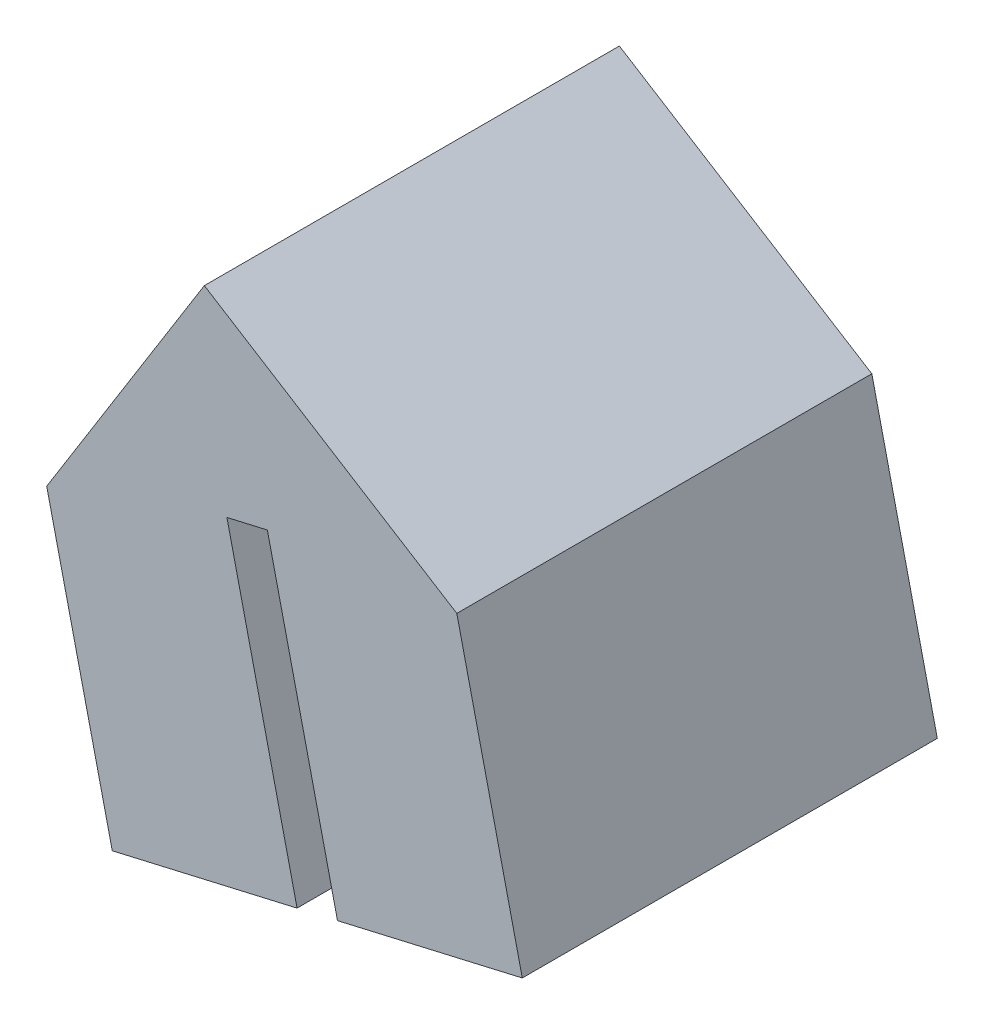
ISO-10303-21;
HEADER;
FILE_DESCRIPTION(('STEP AP214'),'2;1');
FILE_NAME('part.step','',(''),(''),'','','');
FILE_SCHEMA(('AUTOMOTIVE_DESIGN { 1 0 10303 214 1 1 1 1 }'));
ENDSEC;
DATA;
#1=APPLICATION_CONTEXT('core data for automotive mechanical design processes');
#2=APPLICATION_PROTOCOL_DEFINITION('international standard','automotive_design',2000,#1);
#3=PRODUCT_CONTEXT('',#1,'mechanical');
#4=PRODUCT('Part','Part','',(#3));
#5=PRODUCT_RELATED_PRODUCT_CATEGORY('part','',(#4));
#6=PRODUCT_DEFINITION_FORMATION('','',#4);
#7=PRODUCT_DEFINITION_CONTEXT('part definition',#1,'design');
#8=PRODUCT_DEFINITION('design','',#6,#7);
#9=PRODUCT_DEFINITION_SHAPE('','',#8);
#10=(LENGTH_UNIT() NAMED_UNIT(*) SI_UNIT(.MILLI.,.METRE.));
#11=(NAMED_UNIT(*) PLANE_ANGLE_UNIT() SI_UNIT($,.RADIAN.));
#12=(NAMED_UNIT(*) SI_UNIT($,.STERADIAN.) SOLID_ANGLE_UNIT());
#13=UNCERTAINTY_MEASURE_WITH_UNIT(LENGTH_MEASURE(1.E-05),#10,'distance_accuracy_value','');
#14=(GEOMETRIC_REPRESENTATION_CONTEXT(3) GLOBAL_UNCERTAINTY_ASSIGNED_CONTEXT((#13)) GLOBAL_UNIT_ASSIGNED_CONTEXT((#10,
#11,#12)) REPRESENTATION_CONTEXT('',''));
#15=CARTESIAN_POINT('',(0.,0.,0.));
#16=DIRECTION('',(0.,0.,1.));
#17=DIRECTION('',(1.,0.,0.));
#18=AXIS2_PLACEMENT_3D('',#15,#16,#17);
#19=CARTESIAN_POINT('',(2.25778080371376,-9.74178761020695,20.));
#20=DIRECTION('',(-0.225361932494891,0.974275114832648,0.));
#21=DIRECTION('',(-0.974275114832648,-0.225361932494891,0.));
#22=AXIS2_PLACEMENT_3D('',#19,#20,#21);
#23=PLANE('',#22);
#24=DIRECTION('',(0.974275114832648,0.225361932494891,0.));
#25=VECTOR('',#24,1.);
#26=CARTESIAN_POINT('',(2.25778080371376,-9.74178761020695,20.));
#27=LINE('',#26,#25);
#28=CARTESIAN_POINT('',(6.15488126752971,-8.84033989961829,20.));
#29=VERTEX_POINT('',#28);
#30=CARTESIAN_POINT('',(15.0597558273492,-6.78053188092321,20.));
#31=VERTEX_POINT('',#30);
#32=EDGE_CURVE('E119',#29,#31,#27,.T.);
#33=ORIENTED_EDGE('',*,*,#32,.F.);
#34=DIRECTION('',(0.,0.,1.));
#35=VECTOR('',#34,1.);
#36=CARTESIAN_POINT('',(6.15488126752971,-8.84033989961829,0.));
#37=LINE('',#36,#35);
#38=CARTESIAN_POINT('',(6.15488126752971,-8.84033989961829,0.));
#39=VERTEX_POINT('',#38);
#40=EDGE_CURVE('E106',#39,#29,#37,.T.);
#41=ORIENTED_EDGE('',*,*,#40,.F.);
#42=DIRECTION('',(0.974275114832648,0.225361932494891,0.));
#43=VECTOR('',#42,1.);
#44=CARTESIAN_POINT('',(2.25778080371376,-9.74178761020695,0.));
#45=LINE('',#44,#43);
#46=CARTESIAN_POINT('',(15.0597558273492,-6.78053188092321,0.));
#47=VERTEX_POINT('',#46);
#48=EDGE_CURVE('E117',#39,#47,#45,.T.);
#49=ORIENTED_EDGE('',*,*,#48,.T.);
#50=DIRECTION('',(0.,0.,1.));
#51=VECTOR('',#50,1.);
#52=CARTESIAN_POINT('',(15.0597558273492,-6.78053188092321,0.));
#53=LINE('',#52,#51);
#54=EDGE_CURVE('E145',#47,#31,#53,.T.);
#55=ORIENTED_EDGE('',*,*,#54,.T.);
#56=EDGE_LOOP('',(#33,#41,#49,#55));
#57=FACE_BOUND('',#56,.T.);
#58=ADVANCED_FACE('F35',(#57),#23,.F.);
#59=CARTESIAN_POINT('',(17.0083060422801,-6.32980795223431,0.));
#60=VERTEX_POINT('',#59);
#61=CARTESIAN_POINT('',(25.9131805918504,-4.26999988923101,0.));
#62=VERTEX_POINT('',#61);
#63=EDGE_CURVE('E127',#60,#62,#45,.T.);
#64=ORIENTED_EDGE('',*,*,#63,.T.);
#65=DIRECTION('',(0.,0.,1.));
#66=VECTOR('',#65,1.);
#67=CARTESIAN_POINT('',(25.9131805918504,-4.26999988923101,0.));
#68=LINE('',#67,#66);
#69=CARTESIAN_POINT('',(25.9131805918504,-4.26999988923101,20.));
#70=VERTEX_POINT('',#69);
#71=EDGE_CURVE('E50',#62,#70,#68,.T.);
#72=ORIENTED_EDGE('',*,*,#71,.T.);
#73=CARTESIAN_POINT('',(17.0083060422801,-6.32980795223431,20.));
#74=VERTEX_POINT('',#73);
#75=EDGE_CURVE('E135',#74,#70,#27,.T.);
#76=ORIENTED_EDGE('',*,*,#75,.F.);
#77=DIRECTION('',(0.,0.,1.));
#78=VECTOR('',#77,1.);
#79=CARTESIAN_POINT('',(17.0083060422801,-6.32980795223431,0.));
#80=LINE('',#79,#78);
#81=EDGE_CURVE('E180',#60,#74,#80,.T.);
#82=ORIENTED_EDGE('',*,*,#81,.F.);
#83=EDGE_LOOP('',(#64,#72,#76,#82));
#84=FACE_BOUND('',#83,.T.);
#85=ADVANCED_FACE('F37',(#84),#23,.F.);
#86=CARTESIAN_POINT('',(10.5912312477967,16.9654301641807,20.));
#87=DIRECTION('',(-0.529561562389836,-0.848271508209038,0.));
#88=DIRECTION('',(0.848271508209038,-0.529561562389836,0.));
#89=AXIS2_PLACEMENT_3D('',#86,#87,#88);
#90=PLANE('',#89);
#91=DIRECTION('',(-0.848271508209038,0.529561562389836,0.));
#92=VECTOR('',#91,1.);
#93=CARTESIAN_POINT('',(10.5912312477967,16.9654301641807,20.));
#94=LINE('',#93,#92);
#95=CARTESIAN_POINT('',(22.7581131260419,9.36985149095679,20.));
#96=VERTEX_POINT('',#95);
#97=CARTESIAN_POINT('',(10.5912312477967,16.9654301641807,20.));
#98=VERTEX_POINT('',#97);
#99=EDGE_CURVE('E143',#96,#98,#94,.T.);
#100=ORIENTED_EDGE('',*,*,#99,.F.);
#101=DIRECTION('',(0.,0.,1.));
#102=VECTOR('',#101,1.);
#103=CARTESIAN_POINT('',(22.7581131260419,9.36985149095679,0.));
#104=LINE('',#103,#102);
#105=CARTESIAN_POINT('',(22.7581131260419,9.36985149095679,0.));
#106=VERTEX_POINT('',#105);
#107=EDGE_CURVE('E162',#106,#96,#104,.T.);
#108=ORIENTED_EDGE('',*,*,#107,.F.);
#109=DIRECTION('',(-0.848271508209038,0.529561562389836,0.));
#110=VECTOR('',#109,1.);
#111=CARTESIAN_POINT('',(10.5912312477967,16.9654301641807,0.));
#112=LINE('',#111,#110);
#113=CARTESIAN_POINT('',(10.5912312477967,16.9654301641807,0.));
#114=VERTEX_POINT('',#113);
#115=EDGE_CURVE('E126',#106,#114,#112,.T.);
#116=ORIENTED_EDGE('',*,*,#115,.T.);
#117=DIRECTION('',(0.,0.,-1.));
#118=VECTOR('',#117,1.);
#119=CARTESIAN_POINT('',(10.5912312477967,16.9654301641807,20.));
#120=LINE('',#119,#118);
#121=EDGE_CURVE('E11',#98,#114,#120,.T.);
#122=ORIENTED_EDGE('',*,*,#121,.F.);
#123=EDGE_LOOP('',(#100,#108,#116,#122));
#124=FACE_BOUND('',#123,.T.);
#125=ADVANCED_FACE('F205',(#124),#90,.F.);
#126=CARTESIAN_POINT('',(0.,0.,20.));
#127=DIRECTION('',(0.848271508209038,-0.529561562389836,0.));
#128=DIRECTION('',(0.529561562389836,0.848271508209038,0.));
#129=AXIS2_PLACEMENT_3D('',#126,#127,#128);
#130=PLANE('',#129);
#131=DIRECTION('',(-0.529561562389836,-0.848271508209038,0.));
#132=VECTOR('',#131,1.);
#133=CARTESIAN_POINT('',(0.,0.,0.));
#134=LINE('',#133,#132);
#135=CARTESIAN_POINT('',(2.99437360334313,4.79649958200584,0.));
#136=VERTEX_POINT('',#135);
#137=EDGE_CURVE('E129',#114,#136,#134,.T.);
#138=ORIENTED_EDGE('',*,*,#137,.T.);
#139=DIRECTION('',(0.,0.,1.));
#140=VECTOR('',#139,1.);
#141=CARTESIAN_POINT('',(2.99437360334313,4.79649958200584,0.));
#142=LINE('',#141,#140);
#143=CARTESIAN_POINT('',(2.99437360334313,4.79649958200584,20.));
#144=VERTEX_POINT('',#143);
#145=EDGE_CURVE('E58',#136,#144,#142,.T.);
#146=ORIENTED_EDGE('',*,*,#145,.T.);
#147=DIRECTION('',(-0.529561562389836,-0.848271508209038,0.));
#148=VECTOR('',#147,1.);
#149=CARTESIAN_POINT('',(0.,0.,20.));
#150=LINE('',#149,#148);
#151=EDGE_CURVE('E43',#98,#144,#150,.T.);
#152=ORIENTED_EDGE('',*,*,#151,.F.);
#153=ORIENTED_EDGE('',*,*,#121,.T.);
#154=EDGE_LOOP('',(#138,#146,#152,#153));
#155=FACE_BOUND('',#154,.T.);
#156=ADVANCED_FACE('F152',(#155),#130,.F.);
#157=CARTESIAN_POINT('',(0.,0.,20.));
#158=DIRECTION('',(0.,0.,1.));
#159=DIRECTION('',(1.,0.,0.));
#160=AXIS2_PLACEMENT_3D('',#157,#158,#159);
#161=PLANE('',#160);
#162=DIRECTION('',(-0.225778080371377,0.974178761020695,0.));
#163=VECTOR('',#162,1.);
#164=CARTESIAN_POINT('',(6.15488126752971,-8.84033989961829,20.));
#165=LINE('',#164,#163);
#166=EDGE_CURVE('E112',#29,#144,#165,.T.);
#167=ORIENTED_EDGE('',*,*,#166,.F.);
#168=ORIENTED_EDGE('',*,*,#32,.T.);
#169=DIRECTION('',(0.225361964344452,-0.974275107465448,0.));
#170=VECTOR('',#169,1.);
#171=CARTESIAN_POINT('',(11.6793263621824,7.8335947310585,20.));
#172=LINE('',#171,#170);
#173=CARTESIAN_POINT('',(11.6793263621824,7.8335947310585,20.));
#174=VERTEX_POINT('',#173);
#175=EDGE_CURVE('E153',#174,#31,#172,.T.);
#176=ORIENTED_EDGE('',*,*,#175,.F.);
#177=DIRECTION('',(-0.974275107465448,-0.225361964344453,0.));
#178=VECTOR('',#177,1.);
#179=CARTESIAN_POINT('',(13.6278765771133,8.28431865974741,20.));
#180=LINE('',#179,#178);
#181=CARTESIAN_POINT('',(13.6278765771133,8.28431865974741,20.));
#182=VERTEX_POINT('',#181);
#183=EDGE_CURVE('E169',#182,#174,#180,.T.);
#184=ORIENTED_EDGE('',*,*,#183,.F.);
#185=DIRECTION('',(-0.225361964344453,0.974275107465448,0.));
#186=VECTOR('',#185,1.);
#187=CARTESIAN_POINT('',(17.0083060422801,-6.32980795223431,20.));
#188=LINE('',#187,#186);
#189=EDGE_CURVE('E156',#74,#182,#188,.T.);
#190=ORIENTED_EDGE('',*,*,#189,.F.);
#191=ORIENTED_EDGE('',*,*,#75,.T.);
#192=DIRECTION('',(0.225361963920355,-0.974275107563547,0.));
#193=VECTOR('',#192,1.);
#194=CARTESIAN_POINT('',(25.9131805918504,-4.26999988923101,20.));
#195=LINE('',#194,#193);
#196=EDGE_CURVE('E163',#96,#70,#195,.T.);
#197=ORIENTED_EDGE('',*,*,#196,.F.);
#198=ORIENTED_EDGE('',*,*,#99,.T.);
#199=ORIENTED_EDGE('',*,*,#151,.T.);
#200=EDGE_LOOP('',(#167,#168,#176,#184,#190,#191,#197,#198,#199));
#201=FACE_BOUND('',#200,.T.);
#202=ADVANCED_FACE('F151',(#201),#161,.T.);
#203=CARTESIAN_POINT('',(0.,0.,0.));
#204=DIRECTION('',(0.,0.,1.));
#205=DIRECTION('',(1.,0.,0.));
#206=AXIS2_PLACEMENT_3D('',#203,#204,#205);
#207=PLANE('',#206);
#208=ORIENTED_EDGE('',*,*,#48,.F.);
#209=DIRECTION('',(-0.225778080371377,0.974178761020695,0.));
#210=VECTOR('',#209,1.);
#211=CARTESIAN_POINT('',(6.15488126752971,-8.84033989961829,0.));
#212=LINE('',#211,#210);
#213=EDGE_CURVE('E103',#39,#136,#212,.T.);
#214=ORIENTED_EDGE('',*,*,#213,.T.);
#215=ORIENTED_EDGE('',*,*,#137,.F.);
#216=ORIENTED_EDGE('',*,*,#115,.F.);
#217=DIRECTION('',(0.225361963920355,-0.974275107563547,0.));
#218=VECTOR('',#217,1.);
#219=CARTESIAN_POINT('',(25.9131805918504,-4.26999988923101,0.));
#220=LINE('',#219,#218);
#221=EDGE_CURVE('E160',#106,#62,#220,.T.);
#222=ORIENTED_EDGE('',*,*,#221,.T.);
#223=ORIENTED_EDGE('',*,*,#63,.F.);
#224=DIRECTION('',(-0.225361964344453,0.974275107465448,0.));
#225=VECTOR('',#224,1.);
#226=CARTESIAN_POINT('',(17.0083060422801,-6.32980795223431,0.));
#227=LINE('',#226,#225);
#228=CARTESIAN_POINT('',(13.6278765771133,8.28431865974741,0.));
#229=VERTEX_POINT('',#228);
#230=EDGE_CURVE('E168',#60,#229,#227,.T.);
#231=ORIENTED_EDGE('',*,*,#230,.T.);
#232=DIRECTION('',(-0.974275107465448,-0.225361964344453,0.));
#233=VECTOR('',#232,1.);
#234=CARTESIAN_POINT('',(13.6278765771133,8.28431865974741,0.));
#235=LINE('',#234,#233);
#236=CARTESIAN_POINT('',(11.6793263621824,7.8335947310585,0.));
#237=VERTEX_POINT('',#236);
#238=EDGE_CURVE('E172',#229,#237,#235,.T.);
#239=ORIENTED_EDGE('',*,*,#238,.T.);
#240=DIRECTION('',(0.225361964344452,-0.974275107465448,0.));
#241=VECTOR('',#240,1.);
#242=CARTESIAN_POINT('',(11.6793263621824,7.8335947310585,0.));
#243=LINE('',#242,#241);
#244=EDGE_CURVE('E125',#237,#47,#243,.T.);
#245=ORIENTED_EDGE('',*,*,#244,.T.);
#246=EDGE_LOOP('',(#208,#214,#215,#216,#222,#223,#231,#239,#245));
#247=FACE_BOUND('',#246,.T.);
#248=ADVANCED_FACE('F122',(#247),#207,.F.);
#249=CARTESIAN_POINT('',(11.6793263621824,7.8335947310585,0.));
#250=DIRECTION('',(-0.974275107465448,-0.225361964344452,0.));
#251=DIRECTION('',(0.225361964344452,-0.974275107465448,0.));
#252=AXIS2_PLACEMENT_3D('',#249,#250,#251);
#253=PLANE('',#252);
#254=ORIENTED_EDGE('',*,*,#175,.T.);
#255=ORIENTED_EDGE('',*,*,#54,.F.);
#256=ORIENTED_EDGE('',*,*,#244,.F.);
#257=DIRECTION('',(0.,0.,1.));
#258=VECTOR('',#257,1.);
#259=CARTESIAN_POINT('',(11.6793263621824,7.8335947310585,0.));
#260=LINE('',#259,#258);
#261=EDGE_CURVE('E132',#237,#174,#260,.T.);
#262=ORIENTED_EDGE('',*,*,#261,.T.);
#263=EDGE_LOOP('',(#254,#255,#256,#262));
#264=FACE_BOUND('',#263,.T.);
#265=ADVANCED_FACE('F184',(#264),#253,.F.);
#266=CARTESIAN_POINT('',(13.6278765771133,8.28431865974741,0.));
#267=DIRECTION('',(-0.225361964344453,0.974275107465448,0.));
#268=DIRECTION('',(-0.974275107465448,-0.225361964344453,0.));
#269=AXIS2_PLACEMENT_3D('',#266,#267,#268);
#270=PLANE('',#269);
#271=ORIENTED_EDGE('',*,*,#183,.T.);
#272=ORIENTED_EDGE('',*,*,#261,.F.);
#273=ORIENTED_EDGE('',*,*,#238,.F.);
#274=DIRECTION('',(0.,0.,1.));
#275=VECTOR('',#274,1.);
#276=CARTESIAN_POINT('',(13.6278765771133,8.28431865974741,0.));
#277=LINE('',#276,#275);
#278=EDGE_CURVE('E179',#229,#182,#277,.T.);
#279=ORIENTED_EDGE('',*,*,#278,.T.);
#280=EDGE_LOOP('',(#271,#272,#273,#279));
#281=FACE_BOUND('',#280,.T.);
#282=ADVANCED_FACE('F188',(#281),#270,.F.);
#283=CARTESIAN_POINT('',(17.0083060422801,-6.32980795223431,0.));
#284=DIRECTION('',(0.974275107465448,0.225361964344453,0.));
#285=DIRECTION('',(-0.225361964344453,0.974275107465448,0.));
#286=AXIS2_PLACEMENT_3D('',#283,#284,#285);
#287=PLANE('',#286);
#288=ORIENTED_EDGE('',*,*,#189,.T.);
#289=ORIENTED_EDGE('',*,*,#278,.F.);
#290=ORIENTED_EDGE('',*,*,#230,.F.);
#291=ORIENTED_EDGE('',*,*,#81,.T.);
#292=EDGE_LOOP('',(#288,#289,#290,#291));
#293=FACE_BOUND('',#292,.T.);
#294=ADVANCED_FACE('F190',(#293),#287,.F.);
#295=CARTESIAN_POINT('',(25.9131805918504,-4.26999988923101,0.));
#296=DIRECTION('',(-0.974275107563547,-0.225361963920355,0.));
#297=DIRECTION('',(0.225361963920355,-0.974275107563547,0.));
#298=AXIS2_PLACEMENT_3D('',#295,#296,#297);
#299=PLANE('',#298);
#300=ORIENTED_EDGE('',*,*,#196,.T.);
#301=ORIENTED_EDGE('',*,*,#71,.F.);
#302=ORIENTED_EDGE('',*,*,#221,.F.);
#303=ORIENTED_EDGE('',*,*,#107,.T.);
#304=EDGE_LOOP('',(#300,#301,#302,#303));
#305=FACE_BOUND('',#304,.T.);
#306=ADVANCED_FACE('F192',(#305),#299,.F.);
#307=CARTESIAN_POINT('',(6.15488126752971,-8.84033989961829,0.));
#308=DIRECTION('',(0.974178761020695,0.225778080371377,0.));
#309=DIRECTION('',(-0.225778080371377,0.974178761020695,0.));
#310=AXIS2_PLACEMENT_3D('',#307,#308,#309);
#311=PLANE('',#310);
#312=ORIENTED_EDGE('',*,*,#166,.T.);
#313=ORIENTED_EDGE('',*,*,#145,.F.);
#314=ORIENTED_EDGE('',*,*,#213,.F.);
#315=ORIENTED_EDGE('',*,*,#40,.T.);
#316=EDGE_LOOP('',(#312,#313,#314,#315));
#317=FACE_BOUND('',#316,.T.);
#318=ADVANCED_FACE('F105',(#317),#311,.F.);
#319=CLOSED_SHELL('',(#58,#85,#125,#156,#202,#248,#265,#282,#294,#306,#318));
#320=MANIFOLD_SOLID_BREP('B2',#319);
#321=ADVANCED_BREP_SHAPE_REPRESENTATION('',(#18,#320),#14);
#322=SHAPE_DEFINITION_REPRESENTATION(#9,#321);
ENDSEC;
END-ISO-10303-21;
